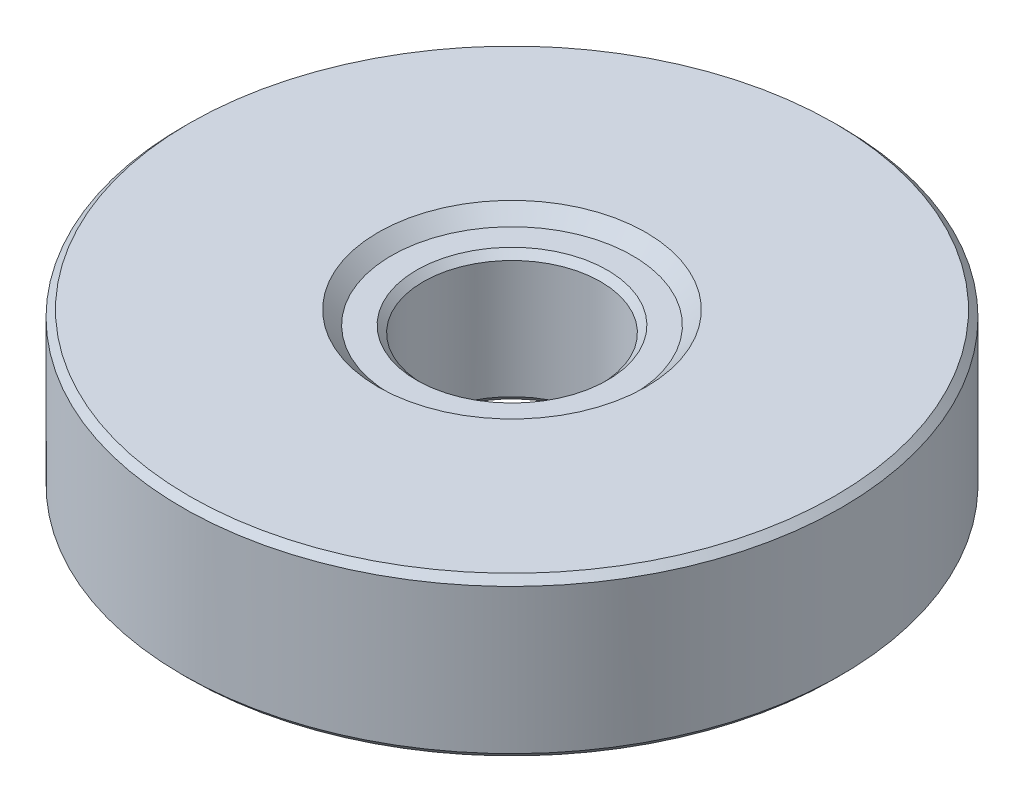
ISO-10303-21;
HEADER;
FILE_DESCRIPTION(('STEP AP214'),'2;1');
FILE_NAME('part.step','',(''),(''),'','','');
FILE_SCHEMA(('AUTOMOTIVE_DESIGN { 1 0 10303 214 1 1 1 1 }'));
ENDSEC;
DATA;
#1=APPLICATION_CONTEXT('core data for automotive mechanical design processes');
#2=APPLICATION_PROTOCOL_DEFINITION('international standard','automotive_design',2000,#1);
#3=PRODUCT_CONTEXT('',#1,'mechanical');
#4=PRODUCT('Part','Part','',(#3));
#5=PRODUCT_RELATED_PRODUCT_CATEGORY('part','',(#4));
#6=PRODUCT_DEFINITION_FORMATION('','',#4);
#7=PRODUCT_DEFINITION_CONTEXT('part definition',#1,'design');
#8=PRODUCT_DEFINITION('design','',#6,#7);
#9=PRODUCT_DEFINITION_SHAPE('','',#8);
#10=(LENGTH_UNIT() NAMED_UNIT(*) SI_UNIT(.MILLI.,.METRE.));
#11=(NAMED_UNIT(*) PLANE_ANGLE_UNIT() SI_UNIT($,.RADIAN.));
#12=(NAMED_UNIT(*) SI_UNIT($,.STERADIAN.) SOLID_ANGLE_UNIT());
#13=UNCERTAINTY_MEASURE_WITH_UNIT(LENGTH_MEASURE(1.E-05),#10,'distance_accuracy_value','');
#14=(GEOMETRIC_REPRESENTATION_CONTEXT(3) GLOBAL_UNCERTAINTY_ASSIGNED_CONTEXT((#13)) GLOBAL_UNIT_ASSIGNED_CONTEXT((#10,
#11,#12)) REPRESENTATION_CONTEXT('',''));
#15=CARTESIAN_POINT('',(0.,0.,0.));
#16=DIRECTION('',(0.,0.,1.));
#17=DIRECTION('',(1.,0.,0.));
#18=AXIS2_PLACEMENT_3D('',#15,#16,#17);
#19=CARTESIAN_POINT('',(-13.8972160975754,20.5831147408341,-8.3435208695164));
#20=DIRECTION('',(0.,-1.,0.));
#21=DIRECTION('',(0.,0.,-1.));
#22=AXIS2_PLACEMENT_3D('',#19,#20,#21);
#23=PLANE('',#22);
#24=CARTESIAN_POINT('',(-13.8972160975754,20.5831147408162,-8.3435208695164));
#25=DIRECTION('',(0.,-1.,0.));
#26=DIRECTION('',(0.,0.,-1.));
#27=AXIS2_PLACEMENT_3D('',#24,#25,#26);
#28=CIRCLE('',#27,4.57199999999602);
#29=CARTESIAN_POINT('',(-13.8972160975754,20.5831147408162,-12.9155208695124));
#30=VERTEX_POINT('',#29);
#31=EDGE_CURVE('E46',#30,#30,#28,.T.);
#32=ORIENTED_EDGE('',*,*,#31,.T.);
#33=EDGE_LOOP('',(#32));
#34=FACE_BOUND('',#33,.T.);
#35=CARTESIAN_POINT('',(-13.8972160975754,20.583114740873,-8.3435208695164));
#36=DIRECTION('',(0.,-1.,0.));
#37=DIRECTION('',(0.,0.,-1.));
#38=AXIS2_PLACEMENT_3D('',#35,#36,#37);
#39=CIRCLE('',#38,3.61949999995658);
#40=CARTESIAN_POINT('',(-13.8972160975754,20.583114740873,-11.963020869473));
#41=VERTEX_POINT('',#40);
#42=EDGE_CURVE('E18',#41,#41,#39,.F.);
#43=ORIENTED_EDGE('',*,*,#42,.T.);
#44=EDGE_LOOP('',(#43));
#45=FACE_BOUND('',#44,.T.);
#46=ADVANCED_FACE('F15',(#34,#45),#23,.T.);
#47=CARTESIAN_POINT('',(-13.8972160975754,20.5831147409867,-8.3435208695164));
#48=DIRECTION('',(0.,-1.,0.));
#49=DIRECTION('',(0.,0.,-1.));
#50=AXIS2_PLACEMENT_3D('',#47,#48,#49);
#51=CONICAL_SURFACE('',#50,3.6194999998429,0.785398163397448);
#52=CARTESIAN_POINT('',(-13.8972160975754,20.8371147408002,-8.3435208695164));
#53=DIRECTION('',(0.,-1.,0.));
#54=DIRECTION('',(0.,0.,-1.));
#55=AXIS2_PLACEMENT_3D('',#52,#53,#54);
#56=CIRCLE('',#55,3.3655);
#57=CARTESIAN_POINT('',(-13.8972160975754,20.8371147408002,-11.7090208695164));
#58=VERTEX_POINT('',#57);
#59=EDGE_CURVE('E30',#58,#58,#56,.F.);
#60=ORIENTED_EDGE('',*,*,#59,.T.);
#61=EDGE_LOOP('',(#60));
#62=FACE_BOUND('',#61,.T.);
#63=ORIENTED_EDGE('',*,*,#42,.F.);
#64=EDGE_LOOP('',(#63));
#65=FACE_BOUND('',#64,.T.);
#66=ADVANCED_FACE('F55',(#62,#65),#51,.F.);
#67=CARTESIAN_POINT('',(-13.8972160975754,20.0751147409051,-8.3435208695164));
#68=DIRECTION('',(0.,-1.,0.));
#69=DIRECTION('',(0.,0.,-1.));
#70=AXIS2_PLACEMENT_3D('',#67,#68,#69);
#71=CONICAL_SURFACE('',#70,5.07999999990716,0.785398163397448);
#72=ORIENTED_EDGE('',*,*,#31,.F.);
#73=EDGE_LOOP('',(#72));
#74=FACE_BOUND('',#73,.T.);
#75=CARTESIAN_POINT('',(-13.8972160975754,20.0751147408482,-8.3435208695164));
#76=DIRECTION('',(0.,-1.,0.));
#77=DIRECTION('',(0.,0.,-1.));
#78=AXIS2_PLACEMENT_3D('',#75,#76,#77);
#79=CIRCLE('',#78,5.079999999964);
#80=CARTESIAN_POINT('',(-13.8972160975754,20.0751147408482,-13.4235208694804));
#81=VERTEX_POINT('',#80);
#82=EDGE_CURVE('E44',#81,#81,#79,.T.);
#83=ORIENTED_EDGE('',*,*,#82,.T.);
#84=EDGE_LOOP('',(#83));
#85=FACE_BOUND('',#84,.T.);
#86=ADVANCED_FACE('F57',(#74,#85),#71,.F.);
#87=CARTESIAN_POINT('',(-13.8972160975754,26.0751147408341,-8.3435208695164));
#88=DIRECTION('',(0.,-1.,0.));
#89=DIRECTION('',(0.,0.,-1.));
#90=AXIS2_PLACEMENT_3D('',#87,#88,#89);
#91=CYLINDRICAL_SURFACE('',#90,3.3655);
#92=CARTESIAN_POINT('',(-13.8972160975754,25.3131147408681,-8.3435208695164));
#93=DIRECTION('',(0.,1.,0.));
#94=DIRECTION('',(-1.,0.,0.));
#95=AXIS2_PLACEMENT_3D('',#92,#93,#94);
#96=CIRCLE('',#95,3.36550000002948);
#97=CARTESIAN_POINT('',(-17.2627160976049,25.3131147408681,-8.3435208695164));
#98=VERTEX_POINT('',#97);
#99=EDGE_CURVE('E43',#98,#98,#96,.T.);
#100=ORIENTED_EDGE('',*,*,#99,.T.);
#101=EDGE_LOOP('',(#100));
#102=FACE_BOUND('',#101,.T.);
#103=ORIENTED_EDGE('',*,*,#59,.F.);
#104=EDGE_LOOP('',(#103));
#105=FACE_BOUND('',#104,.T.);
#106=ADVANCED_FACE('F64',(#102,#105),#91,.F.);
#107=CARTESIAN_POINT('',(-13.8972160975754,20.0751147408341,-8.3435208695164));
#108=DIRECTION('',(0.,1.,0.));
#109=DIRECTION('',(0.,0.,1.));
#110=AXIS2_PLACEMENT_3D('',#107,#108,#109);
#111=PLANE('',#110);
#112=CARTESIAN_POINT('',(-13.8972160975754,20.0751147408341,-8.3435208695164));
#113=DIRECTION('',(0.,1.,0.));
#114=DIRECTION('',(0.,0.,1.));
#115=AXIS2_PLACEMENT_3D('',#112,#113,#114);
#116=CIRCLE('',#115,12.246);
#117=CARTESIAN_POINT('',(-13.8972160975754,20.0751147408341,3.90247913048361));
#118=VERTEX_POINT('',#117);
#119=EDGE_CURVE('E40',#118,#118,#116,.T.);
#120=ORIENTED_EDGE('',*,*,#119,.F.);
#121=EDGE_LOOP('',(#120));
#122=FACE_BOUND('',#121,.T.);
#123=ORIENTED_EDGE('',*,*,#82,.F.);
#124=EDGE_LOOP('',(#123));
#125=FACE_BOUND('',#124,.T.);
#126=ADVANCED_FACE('F97',(#122,#125),#111,.F.);
#127=CARTESIAN_POINT('',(-13.8972160975754,25.5671147406815,-8.3435208695164));
#128=DIRECTION('',(0.,1.,0.));
#129=DIRECTION('',(-1.,0.,0.));
#130=AXIS2_PLACEMENT_3D('',#127,#128,#129);
#131=CONICAL_SURFACE('',#130,3.61949999984294,0.785398163397448);
#132=ORIENTED_EDGE('',*,*,#99,.F.);
#133=EDGE_LOOP('',(#132));
#134=FACE_BOUND('',#133,.T.);
#135=CARTESIAN_POINT('',(-13.8972160975754,25.5671147407383,-8.3435208695164));
#136=DIRECTION('',(0.,1.,0.));
#137=DIRECTION('',(-1.,0.,0.));
#138=AXIS2_PLACEMENT_3D('',#135,#136,#137);
#139=CIRCLE('',#138,3.61949999989974);
#140=CARTESIAN_POINT('',(-17.5167160974751,25.5671147407383,-8.3435208695164));
#141=VERTEX_POINT('',#140);
#142=EDGE_CURVE('E37',#141,#141,#139,.F.);
#143=ORIENTED_EDGE('',*,*,#142,.F.);
#144=EDGE_LOOP('',(#143));
#145=FACE_BOUND('',#144,.T.);
#146=ADVANCED_FACE('F93',(#134,#145),#131,.F.);
#147=CARTESIAN_POINT('',(-13.8972160975754,20.3291147408341,-8.3435208695164));
#148=DIRECTION('',(0.,1.,0.));
#149=DIRECTION('',(0.,0.,1.));
#150=AXIS2_PLACEMENT_3D('',#147,#148,#149);
#151=CONICAL_SURFACE('',#150,12.5,0.785398163397448);
#152=ORIENTED_EDGE('',*,*,#119,.T.);
#153=EDGE_LOOP('',(#152));
#154=FACE_BOUND('',#153,.T.);
#155=CARTESIAN_POINT('',(-13.8972160975754,20.3291147408341,-8.3435208695164));
#156=DIRECTION('',(0.,-1.,0.));
#157=DIRECTION('',(0.,0.,-1.));
#158=AXIS2_PLACEMENT_3D('',#155,#156,#157);
#159=CIRCLE('',#158,12.5);
#160=CARTESIAN_POINT('',(-13.8972160975754,20.3291147408341,-20.8435208695164));
#161=VERTEX_POINT('',#160);
#162=EDGE_CURVE('E36',#161,#161,#159,.F.);
#163=ORIENTED_EDGE('',*,*,#162,.F.);
#164=EDGE_LOOP('',(#163));
#165=FACE_BOUND('',#164,.T.);
#166=ADVANCED_FACE('F89',(#154,#165),#151,.T.);
#167=CARTESIAN_POINT('',(-13.8972160975754,25.5671147408341,-8.3435208695164));
#168=DIRECTION('',(0.,1.,0.));
#169=DIRECTION('',(0.,0.,1.));
#170=AXIS2_PLACEMENT_3D('',#167,#168,#169);
#171=PLANE('',#170);
#172=CARTESIAN_POINT('',(-13.8972160975754,25.5671147409089,-8.3435208695164));
#173=DIRECTION('',(0.,1.,0.));
#174=DIRECTION('',(0.,0.,1.));
#175=AXIS2_PLACEMENT_3D('',#172,#173,#174);
#176=CIRCLE('',#175,4.57199999999603);
#177=CARTESIAN_POINT('',(-13.8972160975754,25.5671147409089,-3.77152086952037));
#178=VERTEX_POINT('',#177);
#179=EDGE_CURVE('E33',#178,#178,#176,.T.);
#180=ORIENTED_EDGE('',*,*,#179,.T.);
#181=EDGE_LOOP('',(#180));
#182=FACE_BOUND('',#181,.T.);
#183=ORIENTED_EDGE('',*,*,#142,.T.);
#184=EDGE_LOOP('',(#183));
#185=FACE_BOUND('',#184,.T.);
#186=ADVANCED_FACE('F85',(#182,#185),#171,.T.);
#187=CARTESIAN_POINT('',(-13.8972160975754,26.0751147408341,-8.3435208695164));
#188=DIRECTION('',(0.,-1.,0.));
#189=DIRECTION('',(0.,0.,-1.));
#190=AXIS2_PLACEMENT_3D('',#187,#188,#189);
#191=CYLINDRICAL_SURFACE('',#190,12.5);
#192=CARTESIAN_POINT('',(-13.8972160975754,25.8211147408341,-8.3435208695164));
#193=DIRECTION('',(0.,-1.,0.));
#194=DIRECTION('',(1.,0.,0.));
#195=AXIS2_PLACEMENT_3D('',#192,#193,#194);
#196=CIRCLE('',#195,12.5);
#197=CARTESIAN_POINT('',(-1.3972160975754,25.8211147408341,-8.3435208695164));
#198=VERTEX_POINT('',#197);
#199=EDGE_CURVE('E27',#198,#198,#196,.F.);
#200=ORIENTED_EDGE('',*,*,#199,.F.);
#201=EDGE_LOOP('',(#200));
#202=FACE_BOUND('',#201,.T.);
#203=ORIENTED_EDGE('',*,*,#162,.T.);
#204=EDGE_LOOP('',(#203));
#205=FACE_BOUND('',#204,.T.);
#206=ADVANCED_FACE('F81',(#202,#205),#191,.T.);
#207=CARTESIAN_POINT('',(-13.8972160975754,26.0751147407632,-8.3435208695164));
#208=DIRECTION('',(0.,1.,0.));
#209=DIRECTION('',(0.,0.,1.));
#210=AXIS2_PLACEMENT_3D('',#207,#208,#209);
#211=CONICAL_SURFACE('',#210,5.07999999985032,0.785398163397448);
#212=ORIENTED_EDGE('',*,*,#179,.F.);
#213=EDGE_LOOP('',(#212));
#214=FACE_BOUND('',#213,.T.);
#215=CARTESIAN_POINT('',(-13.8972160975754,26.0751147408769,-8.3435208695164));
#216=DIRECTION('',(0.,1.,0.));
#217=DIRECTION('',(0.,0.,1.));
#218=AXIS2_PLACEMENT_3D('',#215,#216,#217);
#219=CIRCLE('',#218,5.079999999964);
#220=CARTESIAN_POINT('',(-13.8972160975754,26.0751147408769,-3.2635208695524));
#221=VERTEX_POINT('',#220);
#222=EDGE_CURVE('E22',#221,#221,#219,.F.);
#223=ORIENTED_EDGE('',*,*,#222,.F.);
#224=EDGE_LOOP('',(#223));
#225=FACE_BOUND('',#224,.T.);
#226=ADVANCED_FACE('F74',(#214,#225),#211,.F.);
#227=CARTESIAN_POINT('',(-13.8972160975754,25.8211147408341,-8.3435208695164));
#228=DIRECTION('',(0.,-1.,0.));
#229=DIRECTION('',(0.,0.,-1.));
#230=AXIS2_PLACEMENT_3D('',#227,#228,#229);
#231=CONICAL_SURFACE('',#230,12.5,0.785398163397448);
#232=CARTESIAN_POINT('',(-13.8972160975754,26.0751147408341,-8.3435208695164));
#233=DIRECTION('',(0.,-1.,0.));
#234=DIRECTION('',(0.,0.,-1.));
#235=AXIS2_PLACEMENT_3D('',#232,#233,#234);
#236=CIRCLE('',#235,12.246);
#237=CARTESIAN_POINT('',(-13.8972160975754,26.0751147408341,-20.5895208695164));
#238=VERTEX_POINT('',#237);
#239=EDGE_CURVE('E10',#238,#238,#236,.F.);
#240=ORIENTED_EDGE('',*,*,#239,.F.);
#241=EDGE_LOOP('',(#240));
#242=FACE_BOUND('',#241,.T.);
#243=ORIENTED_EDGE('',*,*,#199,.T.);
#244=EDGE_LOOP('',(#243));
#245=FACE_BOUND('',#244,.T.);
#246=ADVANCED_FACE('F69',(#242,#245),#231,.T.);
#247=CARTESIAN_POINT('',(-13.8972160975754,26.0751147408341,-8.3435208695164));
#248=DIRECTION('',(0.,1.,0.));
#249=DIRECTION('',(0.,0.,1.));
#250=AXIS2_PLACEMENT_3D('',#247,#248,#249);
#251=PLANE('',#250);
#252=ORIENTED_EDGE('',*,*,#239,.T.);
#253=EDGE_LOOP('',(#252));
#254=FACE_BOUND('',#253,.T.);
#255=ORIENTED_EDGE('',*,*,#222,.T.);
#256=EDGE_LOOP('',(#255));
#257=FACE_BOUND('',#256,.T.);
#258=ADVANCED_FACE('F67',(#254,#257),#251,.T.);
#259=CLOSED_SHELL('',(#46,#66,#86,#106,#126,#146,#166,#186,#206,#226,#246,#258));
#260=MANIFOLD_SOLID_BREP('B1',#259);
#261=ADVANCED_BREP_SHAPE_REPRESENTATION('',(#18,#260),#14);
#262=SHAPE_DEFINITION_REPRESENTATION(#9,#261);
ENDSEC;
END-ISO-10303-21;
